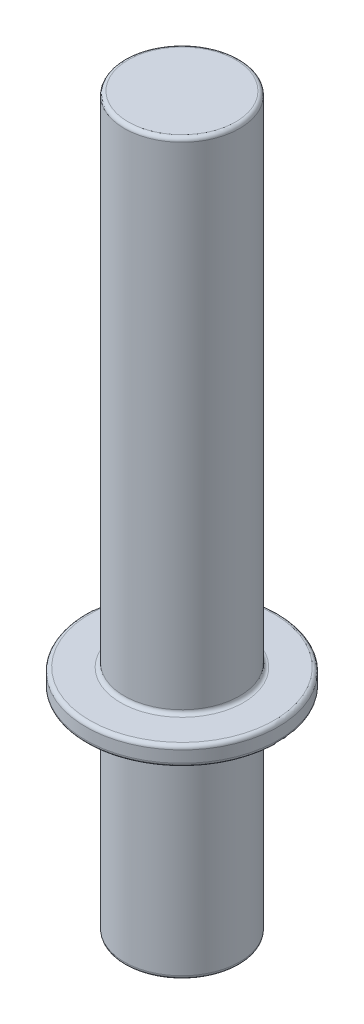
ISO-10303-21;
HEADER;
FILE_DESCRIPTION(('STEP AP214'),'2;1');
FILE_NAME('part.step','',(''),(''),'','','');
FILE_SCHEMA(('AUTOMOTIVE_DESIGN { 1 0 10303 214 1 1 1 1 }'));
ENDSEC;
DATA;
#1=APPLICATION_CONTEXT('core data for automotive mechanical design processes');
#2=APPLICATION_PROTOCOL_DEFINITION('international standard','automotive_design',2000,#1);
#3=PRODUCT_CONTEXT('',#1,'mechanical');
#4=PRODUCT('Part','Part','',(#3));
#5=PRODUCT_RELATED_PRODUCT_CATEGORY('part','',(#4));
#6=PRODUCT_DEFINITION_FORMATION('','',#4);
#7=PRODUCT_DEFINITION_CONTEXT('part definition',#1,'design');
#8=PRODUCT_DEFINITION('design','',#6,#7);
#9=PRODUCT_DEFINITION_SHAPE('','',#8);
#10=(LENGTH_UNIT() NAMED_UNIT(*) SI_UNIT(.MILLI.,.METRE.));
#11=(NAMED_UNIT(*) PLANE_ANGLE_UNIT() SI_UNIT($,.RADIAN.));
#12=(NAMED_UNIT(*) SI_UNIT($,.STERADIAN.) SOLID_ANGLE_UNIT());
#13=UNCERTAINTY_MEASURE_WITH_UNIT(LENGTH_MEASURE(1.E-05),#10,'distance_accuracy_value','');
#14=(GEOMETRIC_REPRESENTATION_CONTEXT(3) GLOBAL_UNCERTAINTY_ASSIGNED_CONTEXT((#13)) GLOBAL_UNIT_ASSIGNED_CONTEXT((#10,
#11,#12)) REPRESENTATION_CONTEXT('',''));
#15=CARTESIAN_POINT('',(0.,0.,0.));
#16=DIRECTION('',(0.,0.,1.));
#17=DIRECTION('',(1.,0.,0.));
#18=AXIS2_PLACEMENT_3D('',#15,#16,#17);
#19=CARTESIAN_POINT('',(0.,19.,0.));
#20=DIRECTION('',(0.,-1.,0.));
#21=DIRECTION('',(0.,0.,-1.));
#22=AXIS2_PLACEMENT_3D('',#19,#20,#21);
#23=CYLINDRICAL_SURFACE('',#22,1.5);
#24=CARTESIAN_POINT('',(0.,0.0999999999999994,0.));
#25=DIRECTION('',(0.,1.,0.));
#26=DIRECTION('',(0.,0.,1.));
#27=AXIS2_PLACEMENT_3D('',#24,#25,#26);
#28=CIRCLE('',#27,1.5);
#29=CARTESIAN_POINT('',(0.,0.0999999999999994,1.5));
#30=VERTEX_POINT('',#29);
#31=EDGE_CURVE('E40',#30,#30,#28,.T.);
#32=ORIENTED_EDGE('',*,*,#31,.T.);
#33=EDGE_LOOP('',(#32));
#34=FACE_BOUND('',#33,.T.);
#35=CARTESIAN_POINT('',(0.,5.5,0.));
#36=DIRECTION('',(0.,-1.,0.));
#37=DIRECTION('',(0.,0.,-1.));
#38=AXIS2_PLACEMENT_3D('',#35,#36,#37);
#39=CIRCLE('',#38,1.5);
#40=CARTESIAN_POINT('',(0.,5.5,-1.5));
#41=VERTEX_POINT('',#40);
#42=EDGE_CURVE('E71',#41,#41,#39,.T.);
#43=ORIENTED_EDGE('',*,*,#42,.T.);
#44=EDGE_LOOP('',(#43));
#45=FACE_BOUND('',#44,.T.);
#46=ADVANCED_FACE('F33',(#34,#45),#23,.T.);
#47=CARTESIAN_POINT('',(0.,0.,0.));
#48=DIRECTION('',(0.,1.,0.));
#49=DIRECTION('',(0.,0.,1.));
#50=AXIS2_PLACEMENT_3D('',#47,#48,#49);
#51=PLANE('',#50);
#52=CARTESIAN_POINT('',(0.,0.,0.));
#53=DIRECTION('',(0.,1.,0.));
#54=DIRECTION('',(0.,0.,1.));
#55=AXIS2_PLACEMENT_3D('',#52,#53,#54);
#56=CIRCLE('',#55,1.4);
#57=CARTESIAN_POINT('',(0.,0.,1.4));
#58=VERTEX_POINT('',#57);
#59=EDGE_CURVE('E10',#58,#58,#56,.F.);
#60=ORIENTED_EDGE('',*,*,#59,.T.);
#61=EDGE_LOOP('',(#60));
#62=FACE_BOUND('',#61,.T.);
#63=ADVANCED_FACE('F79',(#62),#51,.F.);
#64=CARTESIAN_POINT('',(0.,5.5,0.));
#65=DIRECTION('',(0.,-1.,0.));
#66=DIRECTION('',(0.,0.,-1.));
#67=AXIS2_PLACEMENT_3D('',#64,#65,#66);
#68=PLANE('',#67);
#69=CARTESIAN_POINT('',(0.,5.5,0.));
#70=DIRECTION('',(0.,-1.,0.));
#71=DIRECTION('',(0.,0.,-1.));
#72=AXIS2_PLACEMENT_3D('',#69,#70,#71);
#73=CIRCLE('',#72,2.4);
#74=CARTESIAN_POINT('',(0.,5.5,-2.4));
#75=VERTEX_POINT('',#74);
#76=EDGE_CURVE('E68',#75,#75,#73,.T.);
#77=ORIENTED_EDGE('',*,*,#76,.T.);
#78=EDGE_LOOP('',(#77));
#79=FACE_BOUND('',#78,.T.);
#80=ORIENTED_EDGE('',*,*,#42,.F.);
#81=EDGE_LOOP('',(#80));
#82=FACE_BOUND('',#81,.T.);
#83=ADVANCED_FACE('F76',(#79,#82),#68,.T.);
#84=CARTESIAN_POINT('',(0.,6.,0.));
#85=DIRECTION('',(0.,-1.,0.));
#86=DIRECTION('',(0.,0.,-1.));
#87=AXIS2_PLACEMENT_3D('',#84,#85,#86);
#88=PLANE('',#87);
#89=CARTESIAN_POINT('',(0.,6.,0.));
#90=DIRECTION('',(0.,-1.,0.));
#91=DIRECTION('',(0.,0.,-1.));
#92=AXIS2_PLACEMENT_3D('',#89,#90,#91);
#93=CIRCLE('',#92,1.6);
#94=CARTESIAN_POINT('',(0.,6.,-1.6));
#95=VERTEX_POINT('',#94);
#96=EDGE_CURVE('E56',#95,#95,#93,.T.);
#97=ORIENTED_EDGE('',*,*,#96,.T.);
#98=EDGE_LOOP('',(#97));
#99=FACE_BOUND('',#98,.T.);
#100=CARTESIAN_POINT('',(0.,6.,0.));
#101=DIRECTION('',(0.,-1.,0.));
#102=DIRECTION('',(0.,0.,-1.));
#103=AXIS2_PLACEMENT_3D('',#100,#101,#102);
#104=CIRCLE('',#103,2.4);
#105=CARTESIAN_POINT('',(0.,6.,-2.4));
#106=VERTEX_POINT('',#105);
#107=EDGE_CURVE('E59',#106,#106,#104,.F.);
#108=ORIENTED_EDGE('',*,*,#107,.T.);
#109=EDGE_LOOP('',(#108));
#110=FACE_BOUND('',#109,.T.);
#111=ADVANCED_FACE('F78',(#99,#110),#88,.F.);
#112=CARTESIAN_POINT('',(0.,5.5,0.));
#113=DIRECTION('',(0.,1.,0.));
#114=DIRECTION('',(0.,0.,1.));
#115=AXIS2_PLACEMENT_3D('',#112,#113,#114);
#116=CYLINDRICAL_SURFACE('',#115,2.5);
#117=CARTESIAN_POINT('',(0.,5.6,0.));
#118=DIRECTION('',(0.,-1.,0.));
#119=DIRECTION('',(0.,0.,-1.));
#120=AXIS2_PLACEMENT_3D('',#117,#118,#119);
#121=CIRCLE('',#120,2.5);
#122=CARTESIAN_POINT('',(0.,5.6,-2.5));
#123=VERTEX_POINT('',#122);
#124=EDGE_CURVE('E62',#123,#123,#121,.F.);
#125=ORIENTED_EDGE('',*,*,#124,.T.);
#126=EDGE_LOOP('',(#125));
#127=FACE_BOUND('',#126,.T.);
#128=CARTESIAN_POINT('',(0.,5.9,0.));
#129=DIRECTION('',(0.,-1.,0.));
#130=DIRECTION('',(0.,0.,-1.));
#131=AXIS2_PLACEMENT_3D('',#128,#129,#130);
#132=CIRCLE('',#131,2.5);
#133=CARTESIAN_POINT('',(0.,5.9,-2.5));
#134=VERTEX_POINT('',#133);
#135=EDGE_CURVE('E65',#134,#134,#132,.T.);
#136=ORIENTED_EDGE('',*,*,#135,.T.);
#137=EDGE_LOOP('',(#136));
#138=FACE_BOUND('',#137,.T.);
#139=ADVANCED_FACE('F86',(#127,#138),#116,.T.);
#140=CARTESIAN_POINT('',(0.,19.,0.));
#141=DIRECTION('',(0.,1.,0.));
#142=DIRECTION('',(0.,0.,1.));
#143=AXIS2_PLACEMENT_3D('',#140,#141,#142);
#144=PLANE('',#143);
#145=CARTESIAN_POINT('',(0.,19.,0.));
#146=DIRECTION('',(0.,1.,0.));
#147=DIRECTION('',(0.,0.,1.));
#148=AXIS2_PLACEMENT_3D('',#145,#146,#147);
#149=CIRCLE('',#148,1.4);
#150=CARTESIAN_POINT('',(0.,19.,1.4));
#151=VERTEX_POINT('',#150);
#152=EDGE_CURVE('E44',#151,#151,#149,.T.);
#153=ORIENTED_EDGE('',*,*,#152,.T.);
#154=EDGE_LOOP('',(#153));
#155=FACE_BOUND('',#154,.T.);
#156=ADVANCED_FACE('F98',(#155),#144,.T.);
#157=CARTESIAN_POINT('',(0.,6.1,0.));
#158=DIRECTION('',(0.,-1.,0.));
#159=DIRECTION('',(0.,0.,-1.));
#160=AXIS2_PLACEMENT_3D('',#157,#158,#159);
#161=CIRCLE('',#160,1.5);
#162=CARTESIAN_POINT('',(0.,6.1,-1.5));
#163=VERTEX_POINT('',#162);
#164=EDGE_CURVE('E48',#163,#163,#161,.F.);
#165=ORIENTED_EDGE('',*,*,#164,.T.);
#166=EDGE_LOOP('',(#165));
#167=FACE_BOUND('',#166,.T.);
#168=CARTESIAN_POINT('',(0.,18.9,0.));
#169=DIRECTION('',(0.,1.,0.));
#170=DIRECTION('',(0.,0.,1.));
#171=AXIS2_PLACEMENT_3D('',#168,#169,#170);
#172=CIRCLE('',#171,1.5);
#173=CARTESIAN_POINT('',(0.,18.9,1.5));
#174=VERTEX_POINT('',#173);
#175=EDGE_CURVE('E53',#174,#174,#172,.F.);
#176=ORIENTED_EDGE('',*,*,#175,.T.);
#177=EDGE_LOOP('',(#176));
#178=FACE_BOUND('',#177,.T.);
#179=ADVANCED_FACE('F92',(#167,#178),#23,.T.);
#180=CARTESIAN_POINT('',(0.,5.6,0.));
#181=DIRECTION('',(0.,-1.,0.));
#182=DIRECTION('',(0.,0.,-1.));
#183=AXIS2_PLACEMENT_3D('',#180,#181,#182);
#184=TOROIDAL_SURFACE('',#183,2.4,0.1);
#185=ORIENTED_EDGE('',*,*,#124,.F.);
#186=EDGE_LOOP('',(#185));
#187=FACE_BOUND('',#186,.T.);
#188=ORIENTED_EDGE('',*,*,#76,.F.);
#189=EDGE_LOOP('',(#188));
#190=FACE_BOUND('',#189,.T.);
#191=ADVANCED_FACE('F97',(#187,#190),#184,.T.);
#192=CARTESIAN_POINT('',(0.,6.1,0.));
#193=DIRECTION('',(0.,-1.,0.));
#194=DIRECTION('',(0.,0.,-1.));
#195=AXIS2_PLACEMENT_3D('',#192,#193,#194);
#196=TOROIDAL_SURFACE('',#195,1.6,0.1);
#197=ORIENTED_EDGE('',*,*,#164,.F.);
#198=EDGE_LOOP('',(#197));
#199=FACE_BOUND('',#198,.T.);
#200=ORIENTED_EDGE('',*,*,#96,.F.);
#201=EDGE_LOOP('',(#200));
#202=FACE_BOUND('',#201,.T.);
#203=ADVANCED_FACE('F104',(#199,#202),#196,.F.);
#204=CARTESIAN_POINT('',(0.,5.9,0.));
#205=DIRECTION('',(0.,-1.,0.));
#206=DIRECTION('',(0.,0.,-1.));
#207=AXIS2_PLACEMENT_3D('',#204,#205,#206);
#208=TOROIDAL_SURFACE('',#207,2.4,0.1);
#209=ORIENTED_EDGE('',*,*,#107,.F.);
#210=EDGE_LOOP('',(#209));
#211=FACE_BOUND('',#210,.T.);
#212=ORIENTED_EDGE('',*,*,#135,.F.);
#213=EDGE_LOOP('',(#212));
#214=FACE_BOUND('',#213,.T.);
#215=ADVANCED_FACE('F115',(#211,#214),#208,.T.);
#216=CARTESIAN_POINT('',(0.,18.9,0.));
#217=DIRECTION('',(0.,1.,0.));
#218=DIRECTION('',(0.,0.,1.));
#219=AXIS2_PLACEMENT_3D('',#216,#217,#218);
#220=TOROIDAL_SURFACE('',#219,1.4,0.1);
#221=ORIENTED_EDGE('',*,*,#175,.F.);
#222=EDGE_LOOP('',(#221));
#223=FACE_BOUND('',#222,.T.);
#224=ORIENTED_EDGE('',*,*,#152,.F.);
#225=EDGE_LOOP('',(#224));
#226=FACE_BOUND('',#225,.T.);
#227=ADVANCED_FACE('F112',(#223,#226),#220,.T.);
#228=CARTESIAN_POINT('',(0.,0.0999999999999994,0.));
#229=DIRECTION('',(0.,1.,0.));
#230=DIRECTION('',(0.,0.,1.));
#231=AXIS2_PLACEMENT_3D('',#228,#229,#230);
#232=TOROIDAL_SURFACE('',#231,1.4,0.1);
#233=ORIENTED_EDGE('',*,*,#59,.F.);
#234=EDGE_LOOP('',(#233));
#235=FACE_BOUND('',#234,.T.);
#236=ORIENTED_EDGE('',*,*,#31,.F.);
#237=EDGE_LOOP('',(#236));
#238=FACE_BOUND('',#237,.T.);
#239=ADVANCED_FACE('F35',(#235,#238),#232,.T.);
#240=CLOSED_SHELL('',(#46,#63,#83,#111,#139,#156,#179,#191,#203,#215,#227,#239));
#241=MANIFOLD_SOLID_BREP('B2',#240);
#242=ADVANCED_BREP_SHAPE_REPRESENTATION('',(#18,#241),#14);
#243=SHAPE_DEFINITION_REPRESENTATION(#9,#242);
ENDSEC;
END-ISO-10303-21;
